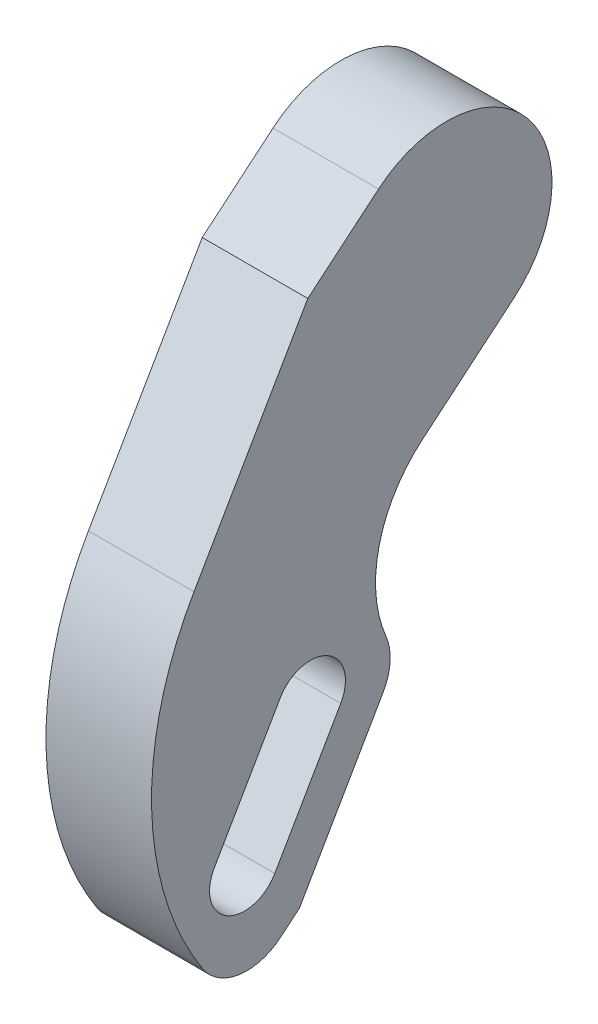
ISO-10303-21;
HEADER;
FILE_DESCRIPTION(('STEP AP214'),'2;1');
FILE_NAME('part.step','',(''),(''),'','','');
FILE_SCHEMA(('AUTOMOTIVE_DESIGN { 1 0 10303 214 1 1 1 1 }'));
ENDSEC;
DATA;
#1=APPLICATION_CONTEXT('core data for automotive mechanical design processes');
#2=APPLICATION_PROTOCOL_DEFINITION('international standard','automotive_design',2000,#1);
#3=PRODUCT_CONTEXT('',#1,'mechanical');
#4=PRODUCT('Part','Part','',(#3));
#5=PRODUCT_RELATED_PRODUCT_CATEGORY('part','',(#4));
#6=PRODUCT_DEFINITION_FORMATION('','',#4);
#7=PRODUCT_DEFINITION_CONTEXT('part definition',#1,'design');
#8=PRODUCT_DEFINITION('design','',#6,#7);
#9=PRODUCT_DEFINITION_SHAPE('','',#8);
#10=(LENGTH_UNIT() NAMED_UNIT(*) SI_UNIT(.MILLI.,.METRE.));
#11=(NAMED_UNIT(*) PLANE_ANGLE_UNIT() SI_UNIT($,.RADIAN.));
#12=(NAMED_UNIT(*) SI_UNIT($,.STERADIAN.) SOLID_ANGLE_UNIT());
#13=UNCERTAINTY_MEASURE_WITH_UNIT(LENGTH_MEASURE(1.E-05),#10,'distance_accuracy_value','');
#14=(GEOMETRIC_REPRESENTATION_CONTEXT(3) GLOBAL_UNCERTAINTY_ASSIGNED_CONTEXT((#13)) GLOBAL_UNIT_ASSIGNED_CONTEXT((#10,
#11,#12)) REPRESENTATION_CONTEXT('',''));
#15=CARTESIAN_POINT('',(0.,0.,0.));
#16=DIRECTION('',(0.,0.,1.));
#17=DIRECTION('',(1.,0.,0.));
#18=AXIS2_PLACEMENT_3D('',#15,#16,#17);
#19=CARTESIAN_POINT('',(4.,-3.0641777724759,-2.57115043874617));
#20=DIRECTION('',(0.,0.766044443118976,0.642787609686542));
#21=DIRECTION('',(0.,-0.642787609686542,0.766044443118976));
#22=AXIS2_PLACEMENT_3D('',#19,#20,#21);
#23=PLANE('',#22);
#24=DIRECTION('',(0.,0.642787609686542,-0.766044443118976));
#25=VECTOR('',#24,1.);
#26=CARTESIAN_POINT('',(4.,-3.0641777724759,-2.57115043874617));
#27=LINE('',#26,#25);
#28=CARTESIAN_POINT('',(4.,-5.97606873909044,0.89910608195932));
#29=VERTEX_POINT('',#28);
#30=CARTESIAN_POINT('',(4.,-3.0641777724759,-2.57115043874617));
#31=VERTEX_POINT('',#30);
#32=EDGE_CURVE('E319',#29,#31,#27,.T.);
#33=ORIENTED_EDGE('',*,*,#32,.F.);
#34=DIRECTION('',(1.,0.,0.));
#35=VECTOR('',#34,1.);
#36=CARTESIAN_POINT('',(4.,-5.97606873909044,0.89910608195932));
#37=LINE('',#36,#35);
#38=CARTESIAN_POINT('',(0.,-5.97606873909044,0.89910608195932));
#39=VERTEX_POINT('',#38);
#40=EDGE_CURVE('E388',#29,#39,#37,.F.);
#41=ORIENTED_EDGE('',*,*,#40,.T.);
#42=DIRECTION('',(0.,0.642787609686542,-0.766044443118976));
#43=VECTOR('',#42,1.);
#44=CARTESIAN_POINT('',(0.,-3.0641777724759,-2.57115043874617));
#45=LINE('',#44,#43);
#46=CARTESIAN_POINT('',(0.,-3.0641777724759,-2.57115043874617));
#47=VERTEX_POINT('',#46);
#48=EDGE_CURVE('E320',#39,#47,#45,.T.);
#49=ORIENTED_EDGE('',*,*,#48,.T.);
#50=DIRECTION('',(-1.,0.,0.));
#51=VECTOR('',#50,1.);
#52=CARTESIAN_POINT('',(4.,-3.0641777724759,-2.57115043874617));
#53=LINE('',#52,#51);
#54=EDGE_CURVE('E328',#31,#47,#53,.T.);
#55=ORIENTED_EDGE('',*,*,#54,.F.);
#56=EDGE_LOOP('',(#33,#41,#49,#55));
#57=FACE_BOUND('',#56,.T.);
#58=ADVANCED_FACE('F36',(#57),#23,.F.);
#59=CARTESIAN_POINT('',(2.5,0.,0.));
#60=DIRECTION('',(-1.,0.,0.));
#61=DIRECTION('',(0.,0.,1.));
#62=AXIS2_PLACEMENT_3D('',#59,#60,#61);
#63=PLANE('',#62);
#64=CARTESIAN_POINT('',(2.5,0.,0.));
#65=DIRECTION('',(-1.,0.,0.));
#66=DIRECTION('',(0.,0.,1.));
#67=AXIS2_PLACEMENT_3D('',#64,#65,#66);
#68=CIRCLE('',#67,2.6);
#69=CARTESIAN_POINT('',(2.5,0.,2.6));
#70=VERTEX_POINT('',#69);
#71=EDGE_CURVE('E310',#70,#70,#68,.T.);
#72=ORIENTED_EDGE('',*,*,#71,.T.);
#73=EDGE_LOOP('',(#72));
#74=FACE_BOUND('',#73,.T.);
#75=DIRECTION('',(0.,0.,-1.));
#76=VECTOR('',#75,1.);
#77=CARTESIAN_POINT('',(2.5,0.750000000000012,1.6));
#78=LINE('',#77,#76);
#79=CARTESIAN_POINT('',(2.5,0.75000000000001,1.3));
#80=VERTEX_POINT('',#79);
#81=CARTESIAN_POINT('',(2.5,0.750000000000006,0.649999999999994));
#82=VERTEX_POINT('',#81);
#83=EDGE_CURVE('E282',#80,#82,#78,.T.);
#84=ORIENTED_EDGE('',*,*,#83,.F.);
#85=CARTESIAN_POINT('',(2.5,0.45000000000001,1.3));
#86=DIRECTION('',(-1.,0.,0.));
#87=DIRECTION('',(0.,0.,1.));
#88=AXIS2_PLACEMENT_3D('',#85,#86,#87);
#89=CIRCLE('',#88,0.3);
#90=CARTESIAN_POINT('',(2.5,0.450000000000012,1.6));
#91=VERTEX_POINT('',#90);
#92=EDGE_CURVE('E366',#80,#91,#89,.F.);
#93=ORIENTED_EDGE('',*,*,#92,.T.);
#94=DIRECTION('',(0.,1.,0.));
#95=VECTOR('',#94,1.);
#96=CARTESIAN_POINT('',(2.5,-0.749999999999988,1.60000000000001));
#97=LINE('',#96,#95);
#98=CARTESIAN_POINT('',(2.5,-0.449999999999989,1.6));
#99=VERTEX_POINT('',#98);
#100=EDGE_CURVE('E257',#99,#91,#97,.T.);
#101=ORIENTED_EDGE('',*,*,#100,.F.);
#102=CARTESIAN_POINT('',(2.5,-0.449999999999991,1.3));
#103=DIRECTION('',(-1.,0.,0.));
#104=DIRECTION('',(0.,0.,1.));
#105=AXIS2_PLACEMENT_3D('',#102,#103,#104);
#106=CIRCLE('',#105,0.3);
#107=CARTESIAN_POINT('',(2.5,-0.749999999999991,1.30000000000001));
#108=VERTEX_POINT('',#107);
#109=EDGE_CURVE('E364',#99,#108,#106,.F.);
#110=ORIENTED_EDGE('',*,*,#109,.T.);
#111=DIRECTION('',(0.,0.,1.));
#112=VECTOR('',#111,1.);
#113=CARTESIAN_POINT('',(2.5,-0.749999999999988,1.60000000000001));
#114=LINE('',#113,#112);
#115=CARTESIAN_POINT('',(2.5,-0.750000000000009,-1.3));
#116=VERTEX_POINT('',#115);
#117=EDGE_CURVE('E262',#116,#108,#114,.T.);
#118=ORIENTED_EDGE('',*,*,#117,.F.);
#119=CARTESIAN_POINT('',(2.5,-0.450000000000009,-1.3));
#120=DIRECTION('',(-1.,0.,0.));
#121=DIRECTION('',(0.,0.,1.));
#122=AXIS2_PLACEMENT_3D('',#119,#120,#121);
#123=CIRCLE('',#122,0.3);
#124=CARTESIAN_POINT('',(2.5,-0.450000000000012,-1.6));
#125=VERTEX_POINT('',#124);
#126=EDGE_CURVE('E368',#116,#125,#123,.F.);
#127=ORIENTED_EDGE('',*,*,#126,.T.);
#128=DIRECTION('',(0.,-1.,0.));
#129=VECTOR('',#128,1.);
#130=CARTESIAN_POINT('',(2.5,-0.750000000000012,-1.6));
#131=LINE('',#130,#129);
#132=CARTESIAN_POINT('',(2.5,0.449999999999989,-1.6));
#133=VERTEX_POINT('',#132);
#134=EDGE_CURVE('E293',#133,#125,#131,.T.);
#135=ORIENTED_EDGE('',*,*,#134,.F.);
#136=CARTESIAN_POINT('',(2.5,0.449999999999991,-1.3));
#137=DIRECTION('',(-1.,0.,0.));
#138=DIRECTION('',(0.,0.,1.));
#139=AXIS2_PLACEMENT_3D('',#136,#137,#138);
#140=CIRCLE('',#139,0.3);
#141=CARTESIAN_POINT('',(2.5,0.749999999999991,-1.30000000000001));
#142=VERTEX_POINT('',#141);
#143=EDGE_CURVE('E370',#133,#142,#140,.F.);
#144=ORIENTED_EDGE('',*,*,#143,.T.);
#145=DIRECTION('',(0.,0.,-1.));
#146=VECTOR('',#145,1.);
#147=CARTESIAN_POINT('',(2.5,0.749999999999996,-0.650000000000005));
#148=LINE('',#147,#146);
#149=CARTESIAN_POINT('',(2.5,0.749999999999996,-0.650000000000005));
#150=VERTEX_POINT('',#149);
#151=EDGE_CURVE('E290',#150,#142,#148,.T.);
#152=ORIENTED_EDGE('',*,*,#151,.F.);
#153=DIRECTION('',(0.,-1.,0.));
#154=VECTOR('',#153,1.);
#155=CARTESIAN_POINT('',(2.5,0.749999999999996,-0.650000000000005));
#156=LINE('',#155,#154);
#157=CARTESIAN_POINT('',(2.5,1.25,-0.650000000000009));
#158=VERTEX_POINT('',#157);
#159=EDGE_CURVE('E288',#158,#150,#156,.T.);
#160=ORIENTED_EDGE('',*,*,#159,.F.);
#161=DIRECTION('',(0.,0.,-1.));
#162=VECTOR('',#161,1.);
#163=CARTESIAN_POINT('',(2.5,1.25000000000001,0.649999999999991));
#164=LINE('',#163,#162);
#165=CARTESIAN_POINT('',(2.5,1.25000000000001,0.649999999999991));
#166=VERTEX_POINT('',#165);
#167=EDGE_CURVE('E286',#166,#158,#164,.T.);
#168=ORIENTED_EDGE('',*,*,#167,.F.);
#169=DIRECTION('',(0.,1.,0.));
#170=VECTOR('',#169,1.);
#171=CARTESIAN_POINT('',(2.5,0.750000000000006,0.649999999999994));
#172=LINE('',#171,#170);
#173=EDGE_CURVE('E284',#82,#166,#172,.T.);
#174=ORIENTED_EDGE('',*,*,#173,.F.);
#175=EDGE_LOOP('',(#84,#93,#101,#110,#118,#127,#135,#144,#152,#160,#168,#174));
#176=FACE_BOUND('',#175,.T.);
#177=ADVANCED_FACE('F458',(#74,#176),#63,.T.);
#178=CARTESIAN_POINT('',(4.,0.,0.));
#179=DIRECTION('',(-1.,0.,0.));
#180=DIRECTION('',(0.,0.,1.));
#181=AXIS2_PLACEMENT_3D('',#178,#179,#180);
#182=CYLINDRICAL_SURFACE('',#181,4.);
#183=DIRECTION('',(-1.,0.,0.));
#184=VECTOR('',#183,1.);
#185=CARTESIAN_POINT('',(4.,3.06417777247591,2.57115043874617));
#186=LINE('',#185,#184);
#187=CARTESIAN_POINT('',(4.,3.0641777724759,2.57115043874617));
#188=VERTEX_POINT('',#187);
#189=CARTESIAN_POINT('',(0.,3.0641777724759,2.57115043874617));
#190=VERTEX_POINT('',#189);
#191=EDGE_CURVE('E322',#188,#190,#186,.T.);
#192=ORIENTED_EDGE('',*,*,#191,.F.);
#193=CARTESIAN_POINT('',(4.,0.,0.));
#194=DIRECTION('',(1.,0.,0.));
#195=DIRECTION('',(0.,0.,-1.));
#196=AXIS2_PLACEMENT_3D('',#193,#194,#195);
#197=CIRCLE('',#196,4.);
#198=EDGE_CURVE('E332',#31,#188,#197,.T.);
#199=ORIENTED_EDGE('',*,*,#198,.F.);
#200=ORIENTED_EDGE('',*,*,#54,.T.);
#201=CARTESIAN_POINT('',(0.,0.,0.));
#202=DIRECTION('',(1.,0.,0.));
#203=DIRECTION('',(0.,0.,-1.));
#204=AXIS2_PLACEMENT_3D('',#201,#202,#203);
#205=CIRCLE('',#204,4.);
#206=EDGE_CURVE('E331',#47,#190,#205,.T.);
#207=ORIENTED_EDGE('',*,*,#206,.T.);
#208=EDGE_LOOP('',(#192,#199,#200,#207));
#209=FACE_BOUND('',#208,.T.);
#210=ADVANCED_FACE('F443',(#209),#182,.T.);
#211=CARTESIAN_POINT('',(4.,0.,0.));
#212=DIRECTION('',(1.,0.,0.));
#213=DIRECTION('',(0.,0.,-1.));
#214=AXIS2_PLACEMENT_3D('',#211,#212,#213);
#215=PLANE('',#214);
#216=CARTESIAN_POINT('',(4.,-12.4349364905389,5.15000000000001));
#217=DIRECTION('',(1.,0.,0.));
#218=DIRECTION('',(0.,0.,-1.));
#219=AXIS2_PLACEMENT_3D('',#216,#217,#218);
#220=CIRCLE('',#219,1.325);
#221=CARTESIAN_POINT('',(4.,-13.0974364905389,4.00251633998562));
#222=VERTEX_POINT('',#221);
#223=CARTESIAN_POINT('',(4.,-11.7724364905389,6.29748366001439));
#224=VERTEX_POINT('',#223);
#225=EDGE_CURVE('E217',#222,#224,#220,.T.);
#226=ORIENTED_EDGE('',*,*,#225,.F.);
#227=DIRECTION('',(0.,0.86602540378444,-0.499999999999998));
#228=VECTOR('',#227,1.);
#229=CARTESIAN_POINT('',(4.,-13.0974364905389,4.00251633998562));
#230=LINE('',#229,#228);
#231=CARTESIAN_POINT('',(4.,-17.4275635094611,6.50251633998561));
#232=VERTEX_POINT('',#231);
#233=EDGE_CURVE('E222',#232,#222,#230,.T.);
#234=ORIENTED_EDGE('',*,*,#233,.F.);
#235=CARTESIAN_POINT('',(4.,-16.7650635094611,7.64999999999999));
#236=DIRECTION('',(1.,0.,0.));
#237=DIRECTION('',(0.,0.,-1.));
#238=AXIS2_PLACEMENT_3D('',#235,#236,#237);
#239=CIRCLE('',#238,1.325);
#240=CARTESIAN_POINT('',(4.,-16.1025635094611,8.79748366001438));
#241=VERTEX_POINT('',#240);
#242=EDGE_CURVE('E245',#241,#232,#239,.T.);
#243=ORIENTED_EDGE('',*,*,#242,.F.);
#244=DIRECTION('',(0.,-0.86602540378444,0.499999999999997));
#245=VECTOR('',#244,1.);
#246=CARTESIAN_POINT('',(4.,-11.7724364905389,6.29748366001439));
#247=LINE('',#246,#245);
#248=EDGE_CURVE('E238',#224,#241,#247,.T.);
#249=ORIENTED_EDGE('',*,*,#248,.F.);
#250=EDGE_LOOP('',(#226,#234,#243,#249));
#251=FACE_BOUND('',#250,.T.);
#252=DIRECTION('',(0.,0.866025403784439,-0.499999999999999));
#253=VECTOR('',#252,1.);
#254=CARTESIAN_POINT('',(4.,-2.34664323188573,-4.06450530486373));
#255=LINE('',#254,#253);
#256=CARTESIAN_POINT('',(4.,-19.0324844341367,5.5690696049112));
#257=VERTEX_POINT('',#256);
#258=CARTESIAN_POINT('',(4.,-13.539267901307,2.39755956096505));
#259=VERTEX_POINT('',#258);
#260=EDGE_CURVE('E382',#257,#259,#255,.T.);
#261=ORIENTED_EDGE('',*,*,#260,.T.);
#262=CARTESIAN_POINT('',(4.,-12.539267901307,4.12961036853393));
#263=DIRECTION('',(1.,0.,0.));
#264=DIRECTION('',(0.,0.,-1.));
#265=AXIS2_PLACEMENT_3D('',#262,#263,#264);
#266=CIRCLE('',#265,2.);
#267=CARTESIAN_POINT('',(4.,-11.7584173451294,2.28834112996041));
#268=VERTEX_POINT('',#267);
#269=EDGE_CURVE('E411',#259,#268,#266,.T.);
#270=ORIENTED_EDGE('',*,*,#269,.T.);
#271=CARTESIAN_POINT('',(4.,-9.80629095468533,-2.31483196647339));
#272=DIRECTION('',(1.,0.,0.));
#273=DIRECTION('',(0.,0.,-1.));
#274=AXIS2_PLACEMENT_3D('',#271,#272,#273);
#275=CIRCLE('',#274,5.);
#276=EDGE_CURVE('E390',#268,#29,#275,.F.);
#277=ORIENTED_EDGE('',*,*,#276,.T.);
#278=ORIENTED_EDGE('',*,*,#32,.T.);
#279=ORIENTED_EDGE('',*,*,#198,.T.);
#280=DIRECTION('',(0.,-0.642787609686541,0.766044443118977));
#281=VECTOR('',#280,1.);
#282=CARTESIAN_POINT('',(4.,3.06417777247591,2.57115043874617));
#283=LINE('',#282,#281);
#284=CARTESIAN_POINT('',(4.,0.814421138573101,5.25230598966248));
#285=VERTEX_POINT('',#284);
#286=EDGE_CURVE('E316',#188,#285,#283,.T.);
#287=ORIENTED_EDGE('',*,*,#286,.T.);
#288=DIRECTION('',(0.,0.866025403784439,-0.5));
#289=VECTOR('',#288,1.);
#290=CARTESIAN_POINT('',(4.,2.47792049239171,4.29188418993853));
#291=LINE('',#290,#289);
#292=CARTESIAN_POINT('',(4.,-6.65448843100536,9.56448294021157));
#293=VERTEX_POINT('',#292);
#294=EDGE_CURVE('E376',#285,#293,#291,.F.);
#295=ORIENTED_EDGE('',*,*,#294,.T.);
#296=CARTESIAN_POINT('',(4.,-12.6544884310054,-0.827821905201693));
#297=DIRECTION('',(1.,0.,0.));
#298=DIRECTION('',(0.,0.,-1.));
#299=AXIS2_PLACEMENT_3D('',#296,#297,#298);
#300=CIRCLE('',#299,12.);
#301=CARTESIAN_POINT('',(4.,-19.1827317473309,9.2410429366189));
#302=VERTEX_POINT('',#301);
#303=EDGE_CURVE('E399',#293,#302,#300,.T.);
#304=ORIENTED_EDGE('',*,*,#303,.T.);
#305=CARTESIAN_POINT('',(4.,-18.09469119461,7.56289879631547));
#306=DIRECTION('',(1.,0.,0.));
#307=DIRECTION('',(0.,0.,-1.));
#308=AXIS2_PLACEMENT_3D('',#305,#306,#307);
#309=CIRCLE('',#308,2.);
#310=CARTESIAN_POINT('',(4.,-19.6267800808479,6.27732357694238));
#311=VERTEX_POINT('',#310);
#312=EDGE_CURVE('E51',#302,#311,#309,.T.);
#313=ORIENTED_EDGE('',*,*,#312,.T.);
#314=DIRECTION('',(0.,-0.642787609686542,0.766044443118976));
#315=VECTOR('',#314,1.);
#316=CARTESIAN_POINT('',(4.,-20.9608472631963,7.86720293426808));
#317=LINE('',#316,#315);
#318=EDGE_CURVE('E255',#257,#311,#317,.T.);
#319=ORIENTED_EDGE('',*,*,#318,.F.);
#320=EDGE_LOOP('',(#261,#270,#277,#278,#279,#287,#295,#304,#313,#319));
#321=FACE_BOUND('',#320,.T.);
#322=ADVANCED_FACE('F424',(#251,#321),#215,.T.);
#323=CARTESIAN_POINT('',(0.,0.,0.));
#324=DIRECTION('',(1.,0.,0.));
#325=DIRECTION('',(0.,0.,-1.));
#326=AXIS2_PLACEMENT_3D('',#323,#324,#325);
#327=PLANE('',#326);
#328=DIRECTION('',(0.,-0.86602540378444,0.499999999999998));
#329=VECTOR('',#328,1.);
#330=CARTESIAN_POINT('',(0.,-13.0974364905389,4.00251633998562));
#331=LINE('',#330,#329);
#332=CARTESIAN_POINT('',(0.,-13.0974364905389,4.00251633998562));
#333=VERTEX_POINT('',#332);
#334=CARTESIAN_POINT('',(0.,-17.4275635094611,6.50251633998561));
#335=VERTEX_POINT('',#334);
#336=EDGE_CURVE('E236',#333,#335,#331,.T.);
#337=ORIENTED_EDGE('',*,*,#336,.F.);
#338=CARTESIAN_POINT('',(0.,-12.4349364905389,5.15000000000001));
#339=DIRECTION('',(1.,0.,0.));
#340=DIRECTION('',(0.,0.,-1.));
#341=AXIS2_PLACEMENT_3D('',#338,#339,#340);
#342=CIRCLE('',#341,1.325);
#343=CARTESIAN_POINT('',(0.,-11.7724364905389,6.29748366001439));
#344=VERTEX_POINT('',#343);
#345=EDGE_CURVE('E214',#344,#333,#342,.F.);
#346=ORIENTED_EDGE('',*,*,#345,.F.);
#347=DIRECTION('',(0.,0.86602540378444,-0.499999999999997));
#348=VECTOR('',#347,1.);
#349=CARTESIAN_POINT('',(0.,-11.7724364905389,6.29748366001439));
#350=LINE('',#349,#348);
#351=CARTESIAN_POINT('',(0.,-16.1025635094611,8.79748366001437));
#352=VERTEX_POINT('',#351);
#353=EDGE_CURVE('E226',#352,#344,#350,.T.);
#354=ORIENTED_EDGE('',*,*,#353,.F.);
#355=CARTESIAN_POINT('',(0.,-16.7650635094611,7.64999999999999));
#356=DIRECTION('',(1.,0.,0.));
#357=DIRECTION('',(0.,0.,-1.));
#358=AXIS2_PLACEMENT_3D('',#355,#356,#357);
#359=CIRCLE('',#358,1.325);
#360=EDGE_CURVE('E240',#335,#352,#359,.F.);
#361=ORIENTED_EDGE('',*,*,#360,.F.);
#362=EDGE_LOOP('',(#337,#346,#354,#361));
#363=FACE_BOUND('',#362,.T.);
#364=CARTESIAN_POINT('',(0.,0.,0.));
#365=DIRECTION('',(-1.,0.,0.));
#366=DIRECTION('',(0.,0.,1.));
#367=AXIS2_PLACEMENT_3D('',#364,#365,#366);
#368=CIRCLE('',#367,2.6);
#369=CARTESIAN_POINT('',(0.,0.,2.6));
#370=VERTEX_POINT('',#369);
#371=EDGE_CURVE('E309',#370,#370,#368,.T.);
#372=ORIENTED_EDGE('',*,*,#371,.F.);
#373=EDGE_LOOP('',(#372));
#374=FACE_BOUND('',#373,.T.);
#375=CARTESIAN_POINT('',(0.,-9.80629095468533,-2.31483196647339));
#376=DIRECTION('',(1.,0.,0.));
#377=DIRECTION('',(0.,0.,-1.));
#378=AXIS2_PLACEMENT_3D('',#375,#376,#377);
#379=CIRCLE('',#378,5.);
#380=CARTESIAN_POINT('',(0.,-11.7584173451294,2.28834112996041));
#381=VERTEX_POINT('',#380);
#382=EDGE_CURVE('E392',#39,#381,#379,.T.);
#383=ORIENTED_EDGE('',*,*,#382,.T.);
#384=CARTESIAN_POINT('',(0.,-12.539267901307,4.12961036853393));
#385=DIRECTION('',(1.,0.,0.));
#386=DIRECTION('',(0.,0.,-1.));
#387=AXIS2_PLACEMENT_3D('',#384,#385,#386);
#388=CIRCLE('',#387,2.);
#389=CARTESIAN_POINT('',(0.,-13.539267901307,2.39755956096505));
#390=VERTEX_POINT('',#389);
#391=EDGE_CURVE('E406',#381,#390,#388,.F.);
#392=ORIENTED_EDGE('',*,*,#391,.T.);
#393=DIRECTION('',(0.,-0.866025403784439,0.499999999999999));
#394=VECTOR('',#393,1.);
#395=CARTESIAN_POINT('',(0.,-19.0324844341367,5.5690696049112));
#396=LINE('',#395,#394);
#397=CARTESIAN_POINT('',(0.,-19.0324844341367,5.5690696049112));
#398=VERTEX_POINT('',#397);
#399=EDGE_CURVE('E385',#390,#398,#396,.T.);
#400=ORIENTED_EDGE('',*,*,#399,.T.);
#401=DIRECTION('',(0.,0.642787609686542,-0.766044443118976));
#402=VECTOR('',#401,1.);
#403=CARTESIAN_POINT('',(0.,-20.9608472631963,7.86720293426808));
#404=LINE('',#403,#402);
#405=CARTESIAN_POINT('',(0.,-19.6267800808479,6.27732357694238));
#406=VERTEX_POINT('',#405);
#407=EDGE_CURVE('E230',#406,#398,#404,.T.);
#408=ORIENTED_EDGE('',*,*,#407,.F.);
#409=CARTESIAN_POINT('',(0.,-18.09469119461,7.56289879631547));
#410=DIRECTION('',(1.,0.,0.));
#411=DIRECTION('',(0.,0.,-1.));
#412=AXIS2_PLACEMENT_3D('',#409,#410,#411);
#413=CIRCLE('',#412,2.);
#414=CARTESIAN_POINT('',(0.,-19.1827317473309,9.2410429366189));
#415=VERTEX_POINT('',#414);
#416=EDGE_CURVE('E404',#406,#415,#413,.F.);
#417=ORIENTED_EDGE('',*,*,#416,.T.);
#418=CARTESIAN_POINT('',(0.,-12.6544884310054,-0.827821905201693));
#419=DIRECTION('',(1.,0.,0.));
#420=DIRECTION('',(0.,0.,-1.));
#421=AXIS2_PLACEMENT_3D('',#418,#419,#420);
#422=CIRCLE('',#421,12.);
#423=CARTESIAN_POINT('',(0.,-6.65448843100535,9.56448294021157));
#424=VERTEX_POINT('',#423);
#425=EDGE_CURVE('E395',#415,#424,#422,.F.);
#426=ORIENTED_EDGE('',*,*,#425,.T.);
#427=DIRECTION('',(0.,-0.866025403784439,0.5));
#428=VECTOR('',#427,1.);
#429=CARTESIAN_POINT('',(0.,-13.931258623137,13.7657281694698));
#430=LINE('',#429,#428);
#431=CARTESIAN_POINT('',(0.,0.814421138573101,5.25230598966248));
#432=VERTEX_POINT('',#431);
#433=EDGE_CURVE('E372',#424,#432,#430,.F.);
#434=ORIENTED_EDGE('',*,*,#433,.T.);
#435=DIRECTION('',(0.,-0.642787609686541,0.766044443118977));
#436=VECTOR('',#435,1.);
#437=CARTESIAN_POINT('',(0.,3.06417777247591,2.57115043874617));
#438=LINE('',#437,#436);
#439=EDGE_CURVE('E313',#190,#432,#438,.T.);
#440=ORIENTED_EDGE('',*,*,#439,.F.);
#441=ORIENTED_EDGE('',*,*,#206,.F.);
#442=ORIENTED_EDGE('',*,*,#48,.F.);
#443=EDGE_LOOP('',(#383,#392,#400,#408,#417,#426,#434,#440,#441,#442));
#444=FACE_BOUND('',#443,.T.);
#445=ADVANCED_FACE('F233',(#363,#374,#444),#327,.F.);
#446=CARTESIAN_POINT('',(4.,3.06417777247591,2.57115043874617));
#447=DIRECTION('',(0.,-0.766044443118977,-0.642787609686541));
#448=DIRECTION('',(0.,0.642787609686541,-0.766044443118977));
#449=AXIS2_PLACEMENT_3D('',#446,#447,#448);
#450=PLANE('',#449);
#451=ORIENTED_EDGE('',*,*,#439,.T.);
#452=DIRECTION('',(1.,0.,0.));
#453=VECTOR('',#452,1.);
#454=CARTESIAN_POINT('',(4.,0.814421138573101,5.25230598966248));
#455=LINE('',#454,#453);
#456=EDGE_CURVE('E374',#432,#285,#455,.T.);
#457=ORIENTED_EDGE('',*,*,#456,.T.);
#458=ORIENTED_EDGE('',*,*,#286,.F.);
#459=ORIENTED_EDGE('',*,*,#191,.T.);
#460=EDGE_LOOP('',(#451,#457,#458,#459));
#461=FACE_BOUND('',#460,.T.);
#462=ADVANCED_FACE('F445',(#461),#450,.F.);
#463=CARTESIAN_POINT('',(2.5,0.,0.));
#464=DIRECTION('',(-1.,0.,0.));
#465=DIRECTION('',(0.,0.,1.));
#466=AXIS2_PLACEMENT_3D('',#463,#464,#465);
#467=CYLINDRICAL_SURFACE('',#466,2.6);
#468=ORIENTED_EDGE('',*,*,#71,.F.);
#469=EDGE_LOOP('',(#468));
#470=FACE_BOUND('',#469,.T.);
#471=ORIENTED_EDGE('',*,*,#371,.T.);
#472=EDGE_LOOP('',(#471));
#473=FACE_BOUND('',#472,.T.);
#474=ADVANCED_FACE('F467',(#470,#473),#467,.F.);
#475=CARTESIAN_POINT('',(0.,-0.749999999999988,1.60000000000001));
#476=DIRECTION('',(0.,0.,-1.));
#477=DIRECTION('',(0.,1.,0.));
#478=AXIS2_PLACEMENT_3D('',#475,#476,#477);
#479=PLANE('',#478);
#480=DIRECTION('',(0.,1.,0.));
#481=VECTOR('',#480,1.);
#482=CARTESIAN_POINT('',(0.,-0.749999999999988,1.60000000000001));
#483=LINE('',#482,#481);
#484=CARTESIAN_POINT('',(0.,-0.449999999999989,1.6));
#485=VERTEX_POINT('',#484);
#486=CARTESIAN_POINT('',(0.,0.450000000000012,1.6));
#487=VERTEX_POINT('',#486);
#488=EDGE_CURVE('E258',#485,#487,#483,.T.);
#489=ORIENTED_EDGE('',*,*,#488,.F.);
#490=DIRECTION('',(1.,0.,0.));
#491=VECTOR('',#490,1.);
#492=CARTESIAN_POINT('',(0.,-0.449999999999989,1.6));
#493=LINE('',#492,#491);
#494=EDGE_CURVE('E338',#485,#99,#493,.T.);
#495=ORIENTED_EDGE('',*,*,#494,.T.);
#496=ORIENTED_EDGE('',*,*,#100,.T.);
#497=DIRECTION('',(1.,0.,0.));
#498=VECTOR('',#497,1.);
#499=CARTESIAN_POINT('',(0.,0.450000000000012,1.6));
#500=LINE('',#499,#498);
#501=EDGE_CURVE('E335',#91,#487,#500,.F.);
#502=ORIENTED_EDGE('',*,*,#501,.T.);
#503=EDGE_LOOP('',(#489,#495,#496,#502));
#504=FACE_BOUND('',#503,.T.);
#505=ADVANCED_FACE('F694',(#504),#479,.F.);
#506=CARTESIAN_POINT('',(0.,0.750000000000012,1.6));
#507=DIRECTION('',(0.,-1.,0.));
#508=DIRECTION('',(0.,0.,-1.));
#509=AXIS2_PLACEMENT_3D('',#506,#507,#508);
#510=PLANE('',#509);
#511=DIRECTION('',(0.,0.,-1.));
#512=VECTOR('',#511,1.);
#513=CARTESIAN_POINT('',(0.,0.750000000000012,1.6));
#514=LINE('',#513,#512);
#515=CARTESIAN_POINT('',(0.,0.75000000000001,1.3));
#516=VERTEX_POINT('',#515);
#517=CARTESIAN_POINT('',(0.,0.750000000000006,0.649999999999994));
#518=VERTEX_POINT('',#517);
#519=EDGE_CURVE('E261',#516,#518,#514,.T.);
#520=ORIENTED_EDGE('',*,*,#519,.F.);
#521=DIRECTION('',(1.,0.,0.));
#522=VECTOR('',#521,1.);
#523=CARTESIAN_POINT('',(0.,0.75000000000001,1.3));
#524=LINE('',#523,#522);
#525=EDGE_CURVE('E354',#516,#80,#524,.T.);
#526=ORIENTED_EDGE('',*,*,#525,.T.);
#527=ORIENTED_EDGE('',*,*,#83,.T.);
#528=DIRECTION('',(1.,0.,0.));
#529=VECTOR('',#528,1.);
#530=CARTESIAN_POINT('',(0.,0.750000000000006,0.649999999999994));
#531=LINE('',#530,#529);
#532=EDGE_CURVE('E306',#518,#82,#531,.T.);
#533=ORIENTED_EDGE('',*,*,#532,.F.);
#534=EDGE_LOOP('',(#520,#526,#527,#533));
#535=FACE_BOUND('',#534,.T.);
#536=ADVANCED_FACE('F685',(#535),#510,.F.);
#537=CARTESIAN_POINT('',(0.,0.750000000000006,0.649999999999994));
#538=DIRECTION('',(0.,0.,-1.));
#539=DIRECTION('',(0.,1.,0.));
#540=AXIS2_PLACEMENT_3D('',#537,#538,#539);
#541=PLANE('',#540);
#542=ORIENTED_EDGE('',*,*,#173,.T.);
#543=DIRECTION('',(1.,0.,0.));
#544=VECTOR('',#543,1.);
#545=CARTESIAN_POINT('',(0.,1.25000000000001,0.649999999999991));
#546=LINE('',#545,#544);
#547=CARTESIAN_POINT('',(0.,1.25000000000001,0.649999999999991));
#548=VERTEX_POINT('',#547);
#549=EDGE_CURVE('E303',#548,#166,#546,.T.);
#550=ORIENTED_EDGE('',*,*,#549,.F.);
#551=DIRECTION('',(0.,1.,0.));
#552=VECTOR('',#551,1.);
#553=CARTESIAN_POINT('',(0.,0.750000000000006,0.649999999999994));
#554=LINE('',#553,#552);
#555=EDGE_CURVE('E264',#518,#548,#554,.T.);
#556=ORIENTED_EDGE('',*,*,#555,.F.);
#557=ORIENTED_EDGE('',*,*,#532,.T.);
#558=EDGE_LOOP('',(#542,#550,#556,#557));
#559=FACE_BOUND('',#558,.T.);
#560=ADVANCED_FACE('F676',(#559),#541,.F.);
#561=CARTESIAN_POINT('',(0.,1.25000000000001,0.649999999999991));
#562=DIRECTION('',(0.,-1.,0.));
#563=DIRECTION('',(0.,0.,-1.));
#564=AXIS2_PLACEMENT_3D('',#561,#562,#563);
#565=PLANE('',#564);
#566=ORIENTED_EDGE('',*,*,#167,.T.);
#567=DIRECTION('',(1.,0.,0.));
#568=VECTOR('',#567,1.);
#569=CARTESIAN_POINT('',(0.,1.25,-0.650000000000009));
#570=LINE('',#569,#568);
#571=CARTESIAN_POINT('',(0.,1.25,-0.650000000000009));
#572=VERTEX_POINT('',#571);
#573=EDGE_CURVE('E300',#572,#158,#570,.T.);
#574=ORIENTED_EDGE('',*,*,#573,.F.);
#575=DIRECTION('',(0.,0.,-1.));
#576=VECTOR('',#575,1.);
#577=CARTESIAN_POINT('',(0.,1.25000000000001,0.649999999999991));
#578=LINE('',#577,#576);
#579=EDGE_CURVE('E266',#548,#572,#578,.T.);
#580=ORIENTED_EDGE('',*,*,#579,.F.);
#581=ORIENTED_EDGE('',*,*,#549,.T.);
#582=EDGE_LOOP('',(#566,#574,#580,#581));
#583=FACE_BOUND('',#582,.T.);
#584=ADVANCED_FACE('F666',(#583),#565,.F.);
#585=CARTESIAN_POINT('',(0.,0.749999999999996,-0.650000000000005));
#586=DIRECTION('',(0.,0.,1.));
#587=DIRECTION('',(0.,-1.,0.));
#588=AXIS2_PLACEMENT_3D('',#585,#586,#587);
#589=PLANE('',#588);
#590=ORIENTED_EDGE('',*,*,#159,.T.);
#591=DIRECTION('',(1.,0.,0.));
#592=VECTOR('',#591,1.);
#593=CARTESIAN_POINT('',(0.,0.749999999999996,-0.650000000000005));
#594=LINE('',#593,#592);
#595=CARTESIAN_POINT('',(0.,0.749999999999996,-0.650000000000005));
#596=VERTEX_POINT('',#595);
#597=EDGE_CURVE('E279',#596,#150,#594,.T.);
#598=ORIENTED_EDGE('',*,*,#597,.F.);
#599=DIRECTION('',(0.,-1.,0.));
#600=VECTOR('',#599,1.);
#601=CARTESIAN_POINT('',(0.,0.749999999999996,-0.650000000000005));
#602=LINE('',#601,#600);
#603=EDGE_CURVE('E268',#572,#596,#602,.T.);
#604=ORIENTED_EDGE('',*,*,#603,.F.);
#605=ORIENTED_EDGE('',*,*,#573,.T.);
#606=EDGE_LOOP('',(#590,#598,#604,#605));
#607=FACE_BOUND('',#606,.T.);
#608=ADVANCED_FACE('F656',(#607),#589,.F.);
#609=CARTESIAN_POINT('',(0.,0.749999999999996,-0.650000000000005));
#610=DIRECTION('',(0.,-1.,0.));
#611=DIRECTION('',(0.,0.,-1.));
#612=AXIS2_PLACEMENT_3D('',#609,#610,#611);
#613=PLANE('',#612);
#614=ORIENTED_EDGE('',*,*,#151,.T.);
#615=DIRECTION('',(1.,0.,0.));
#616=VECTOR('',#615,1.);
#617=CARTESIAN_POINT('',(0.,0.749999999999991,-1.30000000000001));
#618=LINE('',#617,#616);
#619=CARTESIAN_POINT('',(0.,0.749999999999991,-1.30000000000001));
#620=VERTEX_POINT('',#619);
#621=EDGE_CURVE('E362',#142,#620,#618,.F.);
#622=ORIENTED_EDGE('',*,*,#621,.T.);
#623=DIRECTION('',(0.,0.,-1.));
#624=VECTOR('',#623,1.);
#625=CARTESIAN_POINT('',(0.,0.749999999999996,-0.650000000000005));
#626=LINE('',#625,#624);
#627=EDGE_CURVE('E270',#596,#620,#626,.T.);
#628=ORIENTED_EDGE('',*,*,#627,.F.);
#629=ORIENTED_EDGE('',*,*,#597,.T.);
#630=EDGE_LOOP('',(#614,#622,#628,#629));
#631=FACE_BOUND('',#630,.T.);
#632=ADVANCED_FACE('F647',(#631),#613,.F.);
#633=CARTESIAN_POINT('',(0.,-0.750000000000012,-1.6));
#634=DIRECTION('',(0.,0.,1.));
#635=DIRECTION('',(0.,-1.,0.));
#636=AXIS2_PLACEMENT_3D('',#633,#634,#635);
#637=PLANE('',#636);
#638=ORIENTED_EDGE('',*,*,#134,.T.);
#639=DIRECTION('',(1.,0.,0.));
#640=VECTOR('',#639,1.);
#641=CARTESIAN_POINT('',(0.,-0.450000000000012,-1.6));
#642=LINE('',#641,#640);
#643=CARTESIAN_POINT('',(0.,-0.450000000000012,-1.6));
#644=VERTEX_POINT('',#643);
#645=EDGE_CURVE('E360',#125,#644,#642,.F.);
#646=ORIENTED_EDGE('',*,*,#645,.T.);
#647=DIRECTION('',(0.,-1.,0.));
#648=VECTOR('',#647,1.);
#649=CARTESIAN_POINT('',(0.,-0.750000000000012,-1.6));
#650=LINE('',#649,#648);
#651=CARTESIAN_POINT('',(0.,0.449999999999989,-1.6));
#652=VERTEX_POINT('',#651);
#653=EDGE_CURVE('E273',#652,#644,#650,.T.);
#654=ORIENTED_EDGE('',*,*,#653,.F.);
#655=DIRECTION('',(1.,0.,0.));
#656=VECTOR('',#655,1.);
#657=CARTESIAN_POINT('',(0.,0.449999999999989,-1.6));
#658=LINE('',#657,#656);
#659=EDGE_CURVE('E357',#652,#133,#658,.T.);
#660=ORIENTED_EDGE('',*,*,#659,.T.);
#661=EDGE_LOOP('',(#638,#646,#654,#660));
#662=FACE_BOUND('',#661,.T.);
#663=ADVANCED_FACE('F638',(#662),#637,.F.);
#664=CARTESIAN_POINT('',(0.,-0.749999999999988,1.60000000000001));
#665=DIRECTION('',(0.,1.,0.));
#666=DIRECTION('',(0.,0.,1.));
#667=AXIS2_PLACEMENT_3D('',#664,#665,#666);
#668=PLANE('',#667);
#669=ORIENTED_EDGE('',*,*,#117,.T.);
#670=DIRECTION('',(1.,0.,0.));
#671=VECTOR('',#670,1.);
#672=CARTESIAN_POINT('',(0.,-0.749999999999991,1.30000000000001));
#673=LINE('',#672,#671);
#674=CARTESIAN_POINT('',(0.,-0.749999999999991,1.30000000000001));
#675=VERTEX_POINT('',#674);
#676=EDGE_CURVE('E344',#108,#675,#673,.F.);
#677=ORIENTED_EDGE('',*,*,#676,.T.);
#678=DIRECTION('',(0.,0.,1.));
#679=VECTOR('',#678,1.);
#680=CARTESIAN_POINT('',(0.,-0.749999999999988,1.60000000000001));
#681=LINE('',#680,#679);
#682=CARTESIAN_POINT('',(0.,-0.750000000000009,-1.3));
#683=VERTEX_POINT('',#682);
#684=EDGE_CURVE('E276',#683,#675,#681,.T.);
#685=ORIENTED_EDGE('',*,*,#684,.F.);
#686=DIRECTION('',(1.,0.,0.));
#687=VECTOR('',#686,1.);
#688=CARTESIAN_POINT('',(0.,-0.750000000000009,-1.3));
#689=LINE('',#688,#687);
#690=EDGE_CURVE('E341',#683,#116,#689,.T.);
#691=ORIENTED_EDGE('',*,*,#690,.T.);
#692=EDGE_LOOP('',(#669,#677,#685,#691));
#693=FACE_BOUND('',#692,.T.);
#694=ADVANCED_FACE('F629',(#693),#668,.F.);
#695=CARTESIAN_POINT('',(0.,0.,0.));
#696=DIRECTION('',(-1.,0.,0.));
#697=DIRECTION('',(0.,0.,1.));
#698=AXIS2_PLACEMENT_3D('',#695,#696,#697);
#699=PLANE('',#698);
#700=ORIENTED_EDGE('',*,*,#684,.T.);
#701=CARTESIAN_POINT('',(0.,-0.449999999999991,1.3));
#702=DIRECTION('',(-1.,0.,0.));
#703=DIRECTION('',(0.,0.,1.));
#704=AXIS2_PLACEMENT_3D('',#701,#702,#703);
#705=CIRCLE('',#704,0.3);
#706=EDGE_CURVE('E352',#675,#485,#705,.T.);
#707=ORIENTED_EDGE('',*,*,#706,.T.);
#708=ORIENTED_EDGE('',*,*,#488,.T.);
#709=CARTESIAN_POINT('',(0.,0.45000000000001,1.3));
#710=DIRECTION('',(-1.,0.,0.));
#711=DIRECTION('',(0.,0.,1.));
#712=AXIS2_PLACEMENT_3D('',#709,#710,#711);
#713=CIRCLE('',#712,0.3);
#714=EDGE_CURVE('E350',#487,#516,#713,.T.);
#715=ORIENTED_EDGE('',*,*,#714,.T.);
#716=ORIENTED_EDGE('',*,*,#519,.T.);
#717=ORIENTED_EDGE('',*,*,#555,.T.);
#718=ORIENTED_EDGE('',*,*,#579,.T.);
#719=ORIENTED_EDGE('',*,*,#603,.T.);
#720=ORIENTED_EDGE('',*,*,#627,.T.);
#721=CARTESIAN_POINT('',(0.,0.449999999999991,-1.3));
#722=DIRECTION('',(-1.,0.,0.));
#723=DIRECTION('',(0.,0.,1.));
#724=AXIS2_PLACEMENT_3D('',#721,#722,#723);
#725=CIRCLE('',#724,0.3);
#726=EDGE_CURVE('E346',#620,#652,#725,.T.);
#727=ORIENTED_EDGE('',*,*,#726,.T.);
#728=ORIENTED_EDGE('',*,*,#653,.T.);
#729=CARTESIAN_POINT('',(0.,-0.450000000000009,-1.3));
#730=DIRECTION('',(-1.,0.,0.));
#731=DIRECTION('',(0.,0.,1.));
#732=AXIS2_PLACEMENT_3D('',#729,#730,#731);
#733=CIRCLE('',#732,0.3);
#734=EDGE_CURVE('E348',#644,#683,#733,.T.);
#735=ORIENTED_EDGE('',*,*,#734,.T.);
#736=EDGE_LOOP('',(#700,#707,#708,#715,#716,#717,#718,#719,#720,#727,#728,#735));
#737=FACE_BOUND('',#736,.T.);
#738=ADVANCED_FACE('F481',(#737),#699,.T.);
#739=CARTESIAN_POINT('',(0.,-0.449999999999991,1.3));
#740=DIRECTION('',(1.,0.,0.));
#741=DIRECTION('',(0.,0.,-1.));
#742=AXIS2_PLACEMENT_3D('',#739,#740,#741);
#743=CYLINDRICAL_SURFACE('',#742,0.3);
#744=ORIENTED_EDGE('',*,*,#706,.F.);
#745=ORIENTED_EDGE('',*,*,#676,.F.);
#746=ORIENTED_EDGE('',*,*,#109,.F.);
#747=ORIENTED_EDGE('',*,*,#494,.F.);
#748=EDGE_LOOP('',(#744,#745,#746,#747));
#749=FACE_BOUND('',#748,.T.);
#750=ADVANCED_FACE('F477',(#749),#743,.T.);
#751=CARTESIAN_POINT('',(0.,0.45000000000001,1.3));
#752=DIRECTION('',(1.,0.,0.));
#753=DIRECTION('',(0.,0.,-1.));
#754=AXIS2_PLACEMENT_3D('',#751,#752,#753);
#755=CYLINDRICAL_SURFACE('',#754,0.3);
#756=ORIENTED_EDGE('',*,*,#714,.F.);
#757=ORIENTED_EDGE('',*,*,#501,.F.);
#758=ORIENTED_EDGE('',*,*,#92,.F.);
#759=ORIENTED_EDGE('',*,*,#525,.F.);
#760=EDGE_LOOP('',(#756,#757,#758,#759));
#761=FACE_BOUND('',#760,.T.);
#762=ADVANCED_FACE('F480',(#761),#755,.T.);
#763=CARTESIAN_POINT('',(0.,-0.450000000000009,-1.3));
#764=DIRECTION('',(1.,0.,0.));
#765=DIRECTION('',(0.,0.,-1.));
#766=AXIS2_PLACEMENT_3D('',#763,#764,#765);
#767=CYLINDRICAL_SURFACE('',#766,0.3);
#768=ORIENTED_EDGE('',*,*,#734,.F.);
#769=ORIENTED_EDGE('',*,*,#645,.F.);
#770=ORIENTED_EDGE('',*,*,#126,.F.);
#771=ORIENTED_EDGE('',*,*,#690,.F.);
#772=EDGE_LOOP('',(#768,#769,#770,#771));
#773=FACE_BOUND('',#772,.T.);
#774=ADVANCED_FACE('F485',(#773),#767,.T.);
#775=CARTESIAN_POINT('',(0.,0.449999999999991,-1.3));
#776=DIRECTION('',(1.,0.,0.));
#777=DIRECTION('',(0.,0.,-1.));
#778=AXIS2_PLACEMENT_3D('',#775,#776,#777);
#779=CYLINDRICAL_SURFACE('',#778,0.3);
#780=ORIENTED_EDGE('',*,*,#726,.F.);
#781=ORIENTED_EDGE('',*,*,#621,.F.);
#782=ORIENTED_EDGE('',*,*,#143,.F.);
#783=ORIENTED_EDGE('',*,*,#659,.F.);
#784=EDGE_LOOP('',(#780,#781,#782,#783));
#785=FACE_BOUND('',#784,.T.);
#786=ADVANCED_FACE('F489',(#785),#779,.T.);
#787=CARTESIAN_POINT('',(0.,-8.42648887430874,-7.07066370655196));
#788=DIRECTION('',(0.,-0.766044443118976,-0.642787609686542));
#789=DIRECTION('',(0.,0.642787609686542,-0.766044443118976));
#790=AXIS2_PLACEMENT_3D('',#787,#788,#789);
#791=PLANE('',#790);
#792=ORIENTED_EDGE('',*,*,#318,.T.);
#793=DIRECTION('',(-1.,0.,0.));
#794=VECTOR('',#793,1.);
#795=CARTESIAN_POINT('',(0.,-19.6267800808479,6.27732357694238));
#796=LINE('',#795,#794);
#797=EDGE_CURVE('E44',#311,#406,#796,.T.);
#798=ORIENTED_EDGE('',*,*,#797,.T.);
#799=ORIENTED_EDGE('',*,*,#407,.T.);
#800=DIRECTION('',(1.,0.,0.));
#801=VECTOR('',#800,1.);
#802=CARTESIAN_POINT('',(4.,-19.0324844341367,5.5690696049112));
#803=LINE('',#802,#801);
#804=EDGE_CURVE('E379',#398,#257,#803,.T.);
#805=ORIENTED_EDGE('',*,*,#804,.T.);
#806=EDGE_LOOP('',(#792,#798,#799,#805));
#807=FACE_BOUND('',#806,.T.);
#808=ADVANCED_FACE('F416',(#807),#791,.T.);
#809=CARTESIAN_POINT('',(-0.00100000000000013,-12.4349364905389,5.15000000000001));
#810=DIRECTION('',(1.,0.,0.));
#811=DIRECTION('',(0.,0.,-1.));
#812=AXIS2_PLACEMENT_3D('',#809,#810,#811);
#813=CYLINDRICAL_SURFACE('',#812,1.325);
#814=ORIENTED_EDGE('',*,*,#345,.T.);
#815=DIRECTION('',(1.,0.,0.));
#816=VECTOR('',#815,1.);
#817=CARTESIAN_POINT('',(-0.00100000000000013,-13.0974364905389,4.00251633998562));
#818=LINE('',#817,#816);
#819=EDGE_CURVE('E231',#333,#222,#818,.T.);
#820=ORIENTED_EDGE('',*,*,#819,.T.);
#821=ORIENTED_EDGE('',*,*,#225,.T.);
#822=DIRECTION('',(1.,0.,0.));
#823=VECTOR('',#822,1.);
#824=CARTESIAN_POINT('',(-0.00100000000000013,-11.7724364905389,6.29748366001439));
#825=LINE('',#824,#823);
#826=EDGE_CURVE('E210',#344,#224,#825,.T.);
#827=ORIENTED_EDGE('',*,*,#826,.F.);
#828=EDGE_LOOP('',(#814,#820,#821,#827));
#829=FACE_BOUND('',#828,.T.);
#830=ADVANCED_FACE('F212',(#829),#813,.F.);
#831=CARTESIAN_POINT('',(-0.00100000000000013,-13.0974364905389,4.00251633998562));
#832=DIRECTION('',(0.,-0.499999999999998,-0.86602540378444));
#833=DIRECTION('',(0.,0.86602540378444,-0.499999999999998));
#834=AXIS2_PLACEMENT_3D('',#831,#832,#833);
#835=PLANE('',#834);
#836=ORIENTED_EDGE('',*,*,#336,.T.);
#837=DIRECTION('',(1.,0.,0.));
#838=VECTOR('',#837,1.);
#839=CARTESIAN_POINT('',(-0.00100000000000013,-17.4275635094611,6.50251633998561));
#840=LINE('',#839,#838);
#841=EDGE_CURVE('E251',#335,#232,#840,.T.);
#842=ORIENTED_EDGE('',*,*,#841,.T.);
#843=ORIENTED_EDGE('',*,*,#233,.T.);
#844=ORIENTED_EDGE('',*,*,#819,.F.);
#845=EDGE_LOOP('',(#836,#842,#843,#844));
#846=FACE_BOUND('',#845,.T.);
#847=ADVANCED_FACE('F556',(#846),#835,.F.);
#848=CARTESIAN_POINT('',(-0.00100000000000013,-16.7650635094611,7.64999999999999));
#849=DIRECTION('',(1.,0.,0.));
#850=DIRECTION('',(0.,0.,-1.));
#851=AXIS2_PLACEMENT_3D('',#848,#849,#850);
#852=CYLINDRICAL_SURFACE('',#851,1.325);
#853=ORIENTED_EDGE('',*,*,#360,.T.);
#854=DIRECTION('',(1.,0.,0.));
#855=VECTOR('',#854,1.);
#856=CARTESIAN_POINT('',(-0.00100000000000013,-16.1025635094611,8.79748366001438));
#857=LINE('',#856,#855);
#858=EDGE_CURVE('E221',#352,#241,#857,.T.);
#859=ORIENTED_EDGE('',*,*,#858,.T.);
#860=ORIENTED_EDGE('',*,*,#242,.T.);
#861=ORIENTED_EDGE('',*,*,#841,.F.);
#862=EDGE_LOOP('',(#853,#859,#860,#861));
#863=FACE_BOUND('',#862,.T.);
#864=ADVANCED_FACE('F547',(#863),#852,.F.);
#865=CARTESIAN_POINT('',(-0.00100000000000013,-11.7724364905389,6.29748366001439));
#866=DIRECTION('',(0.,0.499999999999997,0.86602540378444));
#867=DIRECTION('',(0.,-0.86602540378444,0.499999999999997));
#868=AXIS2_PLACEMENT_3D('',#865,#866,#867);
#869=PLANE('',#868);
#870=ORIENTED_EDGE('',*,*,#353,.T.);
#871=ORIENTED_EDGE('',*,*,#826,.T.);
#872=ORIENTED_EDGE('',*,*,#248,.T.);
#873=ORIENTED_EDGE('',*,*,#858,.F.);
#874=EDGE_LOOP('',(#870,#871,#872,#873));
#875=FACE_BOUND('',#874,.T.);
#876=ADVANCED_FACE('F227',(#875),#869,.F.);
#877=CARTESIAN_POINT('',(4.,-13.931258623137,13.7657281694698));
#878=DIRECTION('',(0.,-0.5,-0.866025403784438));
#879=DIRECTION('',(-1.,0.,0.));
#880=AXIS2_PLACEMENT_3D('',#877,#878,#879);
#881=PLANE('',#880);
#882=ORIENTED_EDGE('',*,*,#433,.F.);
#883=DIRECTION('',(-1.,0.,0.));
#884=VECTOR('',#883,1.);
#885=CARTESIAN_POINT('',(4.,-6.65448843100536,9.56448294021157));
#886=LINE('',#885,#884);
#887=EDGE_CURVE('E397',#424,#293,#886,.F.);
#888=ORIENTED_EDGE('',*,*,#887,.T.);
#889=ORIENTED_EDGE('',*,*,#294,.F.);
#890=ORIENTED_EDGE('',*,*,#456,.F.);
#891=EDGE_LOOP('',(#882,#888,#889,#890));
#892=FACE_BOUND('',#891,.T.);
#893=ADVANCED_FACE('F450',(#892),#881,.F.);
#894=CARTESIAN_POINT('',(0.,-19.0324844341367,5.5690696049112));
#895=DIRECTION('',(0.,-0.499999999999999,-0.866025403784439));
#896=DIRECTION('',(-1.,0.,0.));
#897=AXIS2_PLACEMENT_3D('',#894,#895,#896);
#898=PLANE('',#897);
#899=ORIENTED_EDGE('',*,*,#399,.F.);
#900=DIRECTION('',(-1.,0.,0.));
#901=VECTOR('',#900,1.);
#902=CARTESIAN_POINT('',(4.,-13.539267901307,2.39755956096505));
#903=LINE('',#902,#901);
#904=EDGE_CURVE('E408',#390,#259,#903,.F.);
#905=ORIENTED_EDGE('',*,*,#904,.T.);
#906=ORIENTED_EDGE('',*,*,#260,.F.);
#907=ORIENTED_EDGE('',*,*,#804,.F.);
#908=EDGE_LOOP('',(#899,#905,#906,#907));
#909=FACE_BOUND('',#908,.T.);
#910=ADVANCED_FACE('F423',(#909),#898,.T.);
#911=CARTESIAN_POINT('',(0.,-9.80629095468533,-2.31483196647339));
#912=DIRECTION('',(1.,0.,0.));
#913=DIRECTION('',(0.,0.,-1.));
#914=AXIS2_PLACEMENT_3D('',#911,#912,#913);
#915=CYLINDRICAL_SURFACE('',#914,5.);
#916=ORIENTED_EDGE('',*,*,#276,.F.);
#917=DIRECTION('',(1.,0.,0.));
#918=VECTOR('',#917,1.);
#919=CARTESIAN_POINT('',(0.,-11.7584173451294,2.28834112996041));
#920=LINE('',#919,#918);
#921=EDGE_CURVE('E401',#268,#381,#920,.F.);
#922=ORIENTED_EDGE('',*,*,#921,.T.);
#923=ORIENTED_EDGE('',*,*,#382,.F.);
#924=ORIENTED_EDGE('',*,*,#40,.F.);
#925=EDGE_LOOP('',(#916,#922,#923,#924));
#926=FACE_BOUND('',#925,.T.);
#927=ADVANCED_FACE('F432',(#926),#915,.F.);
#928=CARTESIAN_POINT('',(4.,-12.6544884310054,-0.827821905201693));
#929=DIRECTION('',(-1.,0.,0.));
#930=DIRECTION('',(0.,0.,1.));
#931=AXIS2_PLACEMENT_3D('',#928,#929,#930);
#932=CYLINDRICAL_SURFACE('',#931,12.);
#933=ORIENTED_EDGE('',*,*,#425,.F.);
#934=DIRECTION('',(-1.,0.,0.));
#935=VECTOR('',#934,1.);
#936=CARTESIAN_POINT('',(4.,-19.1827317473309,9.2410429366189));
#937=LINE('',#936,#935);
#938=EDGE_CURVE('E11',#415,#302,#937,.F.);
#939=ORIENTED_EDGE('',*,*,#938,.T.);
#940=ORIENTED_EDGE('',*,*,#303,.F.);
#941=ORIENTED_EDGE('',*,*,#887,.F.);
#942=EDGE_LOOP('',(#933,#939,#940,#941));
#943=FACE_BOUND('',#942,.T.);
#944=ADVANCED_FACE('F452',(#943),#932,.T.);
#945=CARTESIAN_POINT('',(0.,-12.539267901307,4.12961036853393));
#946=DIRECTION('',(1.,0.,0.));
#947=DIRECTION('',(0.,0.,-1.));
#948=AXIS2_PLACEMENT_3D('',#945,#946,#947);
#949=CYLINDRICAL_SURFACE('',#948,2.);
#950=ORIENTED_EDGE('',*,*,#269,.F.);
#951=ORIENTED_EDGE('',*,*,#904,.F.);
#952=ORIENTED_EDGE('',*,*,#391,.F.);
#953=ORIENTED_EDGE('',*,*,#921,.F.);
#954=EDGE_LOOP('',(#950,#951,#952,#953));
#955=FACE_BOUND('',#954,.T.);
#956=ADVANCED_FACE('F429',(#955),#949,.T.);
#957=CARTESIAN_POINT('',(4.,-18.09469119461,7.56289879631547));
#958=DIRECTION('',(-1.,0.,0.));
#959=DIRECTION('',(0.,0.,1.));
#960=AXIS2_PLACEMENT_3D('',#957,#958,#959);
#961=CYLINDRICAL_SURFACE('',#960,2.);
#962=ORIENTED_EDGE('',*,*,#312,.F.);
#963=ORIENTED_EDGE('',*,*,#938,.F.);
#964=ORIENTED_EDGE('',*,*,#416,.F.);
#965=ORIENTED_EDGE('',*,*,#797,.F.);
#966=EDGE_LOOP('',(#962,#963,#964,#965));
#967=FACE_BOUND('',#966,.T.);
#968=ADVANCED_FACE('F38',(#967),#961,.T.);
#969=CLOSED_SHELL('',(#58,#177,#210,#322,#445,#462,#474,#505,#536,#560,#584,#608,#632,#663,#694,
#738,#750,#762,#774,#786,#808,#830,#847,#864,#876,#893,#910,#927,#944,#956,#968));
#970=MANIFOLD_SOLID_BREP('B2',#969);
#971=ADVANCED_BREP_SHAPE_REPRESENTATION('',(#18,#970),#14);
#972=SHAPE_DEFINITION_REPRESENTATION(#9,#971);
ENDSEC;
END-ISO-10303-21;
